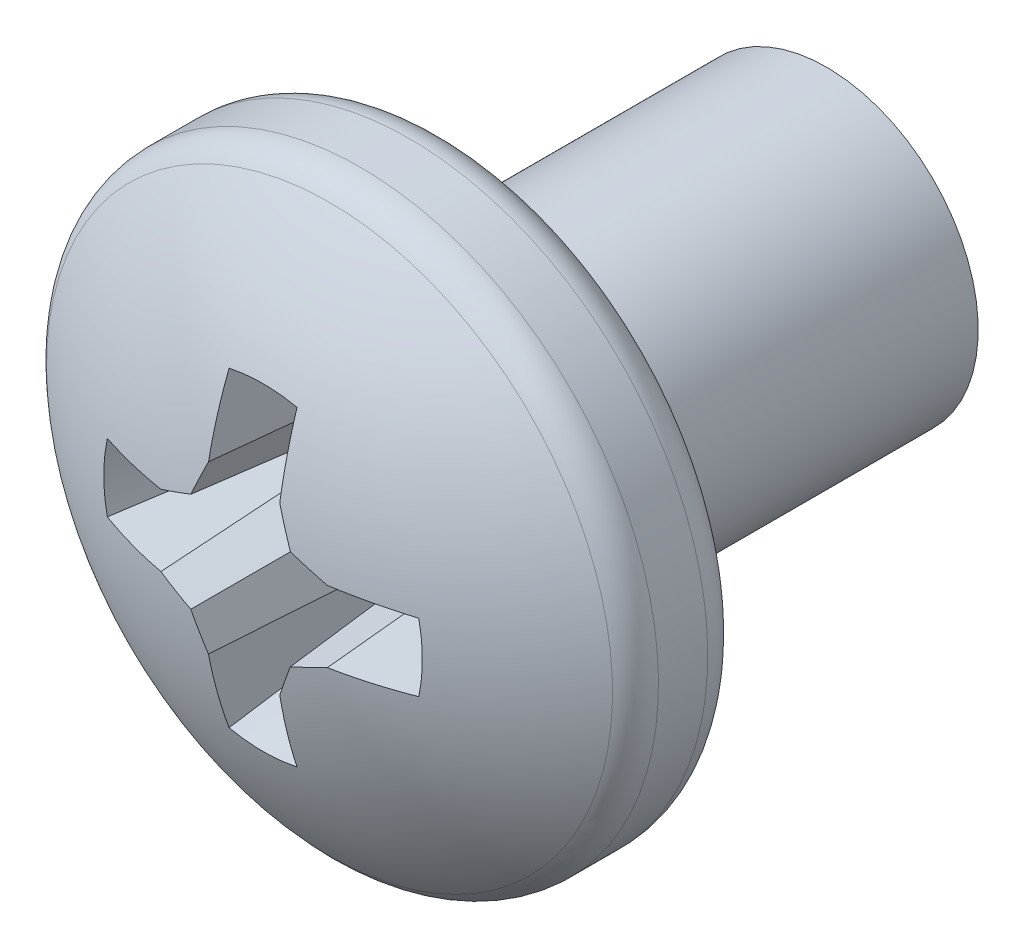
ISO-10303-21;
HEADER;
FILE_DESCRIPTION(('STEP AP214'),'2;1');
FILE_NAME('part.step','',(''),(''),'','','');
FILE_SCHEMA(('AUTOMOTIVE_DESIGN { 1 0 10303 214 1 1 1 1 }'));
ENDSEC;
DATA;
#1=APPLICATION_CONTEXT('core data for automotive mechanical design processes');
#2=APPLICATION_PROTOCOL_DEFINITION('international standard','automotive_design',2000,#1);
#3=PRODUCT_CONTEXT('',#1,'mechanical');
#4=PRODUCT('Part','Part','',(#3));
#5=PRODUCT_RELATED_PRODUCT_CATEGORY('part','',(#4));
#6=PRODUCT_DEFINITION_FORMATION('','',#4);
#7=PRODUCT_DEFINITION_CONTEXT('part definition',#1,'design');
#8=PRODUCT_DEFINITION('design','',#6,#7);
#9=PRODUCT_DEFINITION_SHAPE('','',#8);
#10=(LENGTH_UNIT() NAMED_UNIT(*) SI_UNIT(.MILLI.,.METRE.));
#11=(NAMED_UNIT(*) PLANE_ANGLE_UNIT() SI_UNIT($,.RADIAN.));
#12=(NAMED_UNIT(*) SI_UNIT($,.STERADIAN.) SOLID_ANGLE_UNIT());
#13=UNCERTAINTY_MEASURE_WITH_UNIT(LENGTH_MEASURE(1.E-05),#10,'distance_accuracy_value','');
#14=(GEOMETRIC_REPRESENTATION_CONTEXT(3) GLOBAL_UNCERTAINTY_ASSIGNED_CONTEXT((#13)) GLOBAL_UNIT_ASSIGNED_CONTEXT((#10,
#11,#12)) REPRESENTATION_CONTEXT('',''));
#15=CARTESIAN_POINT('',(0.,0.,0.));
#16=DIRECTION('',(0.,0.,1.));
#17=DIRECTION('',(1.,0.,0.));
#18=AXIS2_PLACEMENT_3D('',#15,#16,#17);
#19=CARTESIAN_POINT('',(0.,0.,7.9375));
#20=DIRECTION('',(0.,0.,-1.));
#21=DIRECTION('',(-1.,0.,0.));
#22=AXIS2_PLACEMENT_3D('',#19,#20,#21);
#23=PLANE('',#22);
#24=CARTESIAN_POINT('',(0.,0.,7.9375));
#25=DIRECTION('',(0.,0.,-1.));
#26=DIRECTION('',(-1.,0.,0.));
#27=AXIS2_PLACEMENT_3D('',#24,#25,#26);
#28=CIRCLE('',#27,3.175);
#29=CARTESIAN_POINT('',(-3.175,0.,7.9375));
#30=VERTEX_POINT('',#29);
#31=EDGE_CURVE('E11',#30,#30,#28,.T.);
#32=ORIENTED_EDGE('',*,*,#31,.F.);
#33=EDGE_LOOP('',(#32));
#34=FACE_BOUND('',#33,.T.);
#35=CARTESIAN_POINT('',(0.,0.,7.93749999999999));
#36=DIRECTION('',(0.,0.,1.));
#37=DIRECTION('',(0.,-1.,0.));
#38=AXIS2_PLACEMENT_3D('',#35,#36,#37);
#39=CIRCLE('',#38,5.4483);
#40=CARTESIAN_POINT('',(0.,-5.4483,7.93749999999999));
#41=VERTEX_POINT('',#40);
#42=EDGE_CURVE('E664',#41,#41,#39,.T.);
#43=ORIENTED_EDGE('',*,*,#42,.F.);
#44=EDGE_LOOP('',(#43));
#45=FACE_BOUND('',#44,.T.);
#46=ADVANCED_FACE('F35',(#34,#45),#23,.T.);
#47=CARTESIAN_POINT('',(0.,0.,8.73759999999999));
#48=DIRECTION('',(0.,0.,1.));
#49=DIRECTION('',(0.,-1.,0.));
#50=AXIS2_PLACEMENT_3D('',#47,#48,#49);
#51=TOROIDAL_SURFACE('',#50,5.4483,0.800099999999999);
#52=ORIENTED_EDGE('',*,*,#42,.T.);
#53=EDGE_LOOP('',(#52));
#54=FACE_BOUND('',#53,.T.);
#55=CARTESIAN_POINT('',(0.,0.,8.73759999999999));
#56=DIRECTION('',(0.,0.,1.));
#57=DIRECTION('',(0.,-1.,0.));
#58=AXIS2_PLACEMENT_3D('',#55,#56,#57);
#59=CIRCLE('',#58,6.24839999999999);
#60=CARTESIAN_POINT('',(0.,-6.2484,8.73759999999998));
#61=VERTEX_POINT('',#60);
#62=EDGE_CURVE('E667',#61,#61,#59,.T.);
#63=ORIENTED_EDGE('',*,*,#62,.F.);
#64=EDGE_LOOP('',(#63));
#65=FACE_BOUND('',#64,.T.);
#66=ADVANCED_FACE('F221',(#54,#65),#51,.T.);
#67=CARTESIAN_POINT('',(0.,0.,0.));
#68=DIRECTION('',(0.,0.,-1.));
#69=DIRECTION('',(-1.,0.,0.));
#70=AXIS2_PLACEMENT_3D('',#67,#68,#69);
#71=CYLINDRICAL_SURFACE('',#70,6.24839999999999);
#72=ORIENTED_EDGE('',*,*,#62,.T.);
#73=EDGE_LOOP('',(#72));
#74=FACE_BOUND('',#73,.T.);
#75=CARTESIAN_POINT('',(0.,0.,9.76982109068952));
#76=DIRECTION('',(0.,0.,1.));
#77=DIRECTION('',(0.,-1.,0.));
#78=AXIS2_PLACEMENT_3D('',#75,#76,#77);
#79=CIRCLE('',#78,6.2484);
#80=CARTESIAN_POINT('',(0.,-6.2484,9.76982109068951));
#81=VERTEX_POINT('',#80);
#82=EDGE_CURVE('E671',#81,#81,#79,.T.);
#83=ORIENTED_EDGE('',*,*,#82,.F.);
#84=EDGE_LOOP('',(#83));
#85=FACE_BOUND('',#84,.T.);
#86=ADVANCED_FACE('F227',(#74,#85),#71,.T.);
#87=CARTESIAN_POINT('',(0.,0.,2.48778485714284));
#88=DIRECTION('',(0.,0.,1.));
#89=DIRECTION('',(0.,1.,0.));
#90=AXIS2_PLACEMENT_3D('',#87,#88,#89);
#91=SPHERICAL_SURFACE('',#90,9.89471514285716);
#92=CARTESIAN_POINT('',(0.,0.,11.8027597430115));
#93=DIRECTION('',(0.,0.,-1.));
#94=DIRECTION('',(-1.,0.,0.));
#95=AXIS2_PLACEMENT_3D('',#92,#93,#94);
#96=CIRCLE('',#95,3.33715906632012);
#97=CARTESIAN_POINT('',(3.26047732574647,-0.711279299723926,11.8027597430115));
#98=VERTEX_POINT('',#97);
#99=CARTESIAN_POINT('',(3.26047732574647,0.711279299723897,11.8027597430115));
#100=VERTEX_POINT('',#99);
#101=EDGE_CURVE('E374',#98,#100,#96,.F.);
#102=ORIENTED_EDGE('',*,*,#101,.F.);
#103=CARTESIAN_POINT('',(0.,0.102887872647611,2.4967863796138));
#104=DIRECTION('',(0.,0.996194698091745,0.0871557427476594));
#105=DIRECTION('',(0.,-0.0871557427476594,0.996194698091745));
#106=AXIS2_PLACEMENT_3D('',#103,#104,#105);
#107=CIRCLE('',#106,9.89417610600004);
#108=CARTESIAN_POINT('',(1.74305929475043,-0.7459592414911,12.1991532912671));
#109=VERTEX_POINT('',#108);
#110=EDGE_CURVE('E44',#109,#98,#107,.T.);
#111=ORIENTED_EDGE('',*,*,#110,.F.);
#112=CARTESIAN_POINT('',(0.192387852615012,-0.464465363019021,2.44380135882443));
#113=DIRECTION('',(-0.381227206369642,0.920363891963229,0.0871557427476598));
#114=DIRECTION('',(-0.923879532511292,-0.382683432365078,0.));
#115=AXIS2_PLACEMENT_3D('',#112,#113,#114);
#116=CIRCLE('',#115,9.88183748352928);
#117=CARTESIAN_POINT('',(1.04287867560571,-1.04287867560572,12.271965757669));
#118=VERTEX_POINT('',#117);
#119=EDGE_CURVE('E392',#118,#109,#116,.T.);
#120=ORIENTED_EDGE('',*,*,#119,.F.);
#121=CARTESIAN_POINT('',(0.464465363019016,-0.192387852615024,2.44380135882443));
#122=DIRECTION('',(-0.920363891963226,0.38122720636965,0.0871557427476598));
#123=DIRECTION('',(-0.382683432365087,-0.923879532511288,0.));
#124=AXIS2_PLACEMENT_3D('',#121,#122,#123);
#125=CIRCLE('',#124,9.88183748352928);
#126=CARTESIAN_POINT('',(0.745959241491083,-1.74305929475044,12.1991532912671));
#127=VERTEX_POINT('',#126);
#128=EDGE_CURVE('E396',#127,#118,#125,.T.);
#129=ORIENTED_EDGE('',*,*,#128,.F.);
#130=CARTESIAN_POINT('',(-0.102887872647616,0.,2.4967863796138));
#131=DIRECTION('',(-0.996194698091745,0.,0.0871557427476594));
#132=DIRECTION('',(0.0871557427476594,0.,0.996194698091745));
#133=AXIS2_PLACEMENT_3D('',#130,#131,#132);
#134=CIRCLE('',#133,9.89417610600004);
#135=CARTESIAN_POINT('',(0.711279299723898,-3.2604773257465,11.8027597430115));
#136=VERTEX_POINT('',#135);
#137=EDGE_CURVE('E353',#136,#127,#134,.T.);
#138=ORIENTED_EDGE('',*,*,#137,.F.);
#139=CARTESIAN_POINT('',(0.,0.,11.8027597430115));
#140=DIRECTION('',(0.,0.,-1.));
#141=DIRECTION('',(0.,1.,0.));
#142=AXIS2_PLACEMENT_3D('',#139,#140,#141);
#143=CIRCLE('',#142,3.33715906632012);
#144=CARTESIAN_POINT('',(-0.711279299723924,-3.2604773257465,11.8027597430115));
#145=VERTEX_POINT('',#144);
#146=EDGE_CURVE('E401',#145,#136,#143,.F.);
#147=ORIENTED_EDGE('',*,*,#146,.F.);
#148=CARTESIAN_POINT('',(0.102887872647614,0.,2.4967863796138));
#149=DIRECTION('',(0.996194698091746,0.,0.0871557427476584));
#150=DIRECTION('',(0.0871557427476584,0.,-0.996194698091746));
#151=AXIS2_PLACEMENT_3D('',#148,#149,#150);
#152=CIRCLE('',#151,9.89417610600004);
#153=CARTESIAN_POINT('',(-0.745959241491093,-1.74305929475044,12.1991532912671));
#154=VERTEX_POINT('',#153);
#155=EDGE_CURVE('E333',#154,#145,#152,.T.);
#156=ORIENTED_EDGE('',*,*,#155,.F.);
#157=CARTESIAN_POINT('',(-0.464465363019017,-0.192387852615018,2.44380135882443));
#158=DIRECTION('',(0.920363891963231,0.381227206369638,0.0871557427476592));
#159=DIRECTION('',(-0.382683432365075,0.923879532511293,0.));
#160=AXIS2_PLACEMENT_3D('',#157,#158,#159);
#161=CIRCLE('',#160,9.88183748352928);
#162=CARTESIAN_POINT('',(-1.04287867560571,-1.04287867560572,12.271965757669));
#163=VERTEX_POINT('',#162);
#164=EDGE_CURVE('E417',#163,#154,#161,.T.);
#165=ORIENTED_EDGE('',*,*,#164,.F.);
#166=CARTESIAN_POINT('',(-0.192387852615018,-0.46446536301902,2.44380135882443));
#167=DIRECTION('',(0.381227206369654,0.920363891963224,0.0871557427476603));
#168=DIRECTION('',(-0.923879532511287,0.38268343236509,0.));
#169=AXIS2_PLACEMENT_3D('',#166,#167,#168);
#170=CIRCLE('',#169,9.88183748352928);
#171=CARTESIAN_POINT('',(-1.74305929475043,-0.74595924149109,12.1991532912671));
#172=VERTEX_POINT('',#171);
#173=EDGE_CURVE('E418',#172,#163,#170,.T.);
#174=ORIENTED_EDGE('',*,*,#173,.F.);
#175=CARTESIAN_POINT('',(0.,0.102887872647613,2.4967863796138));
#176=DIRECTION('',(0.,0.996194698091745,0.0871557427476605));
#177=DIRECTION('',(0.,-0.0871557427476605,0.996194698091745));
#178=AXIS2_PLACEMENT_3D('',#175,#176,#177);
#179=CIRCLE('',#178,9.89417610600004);
#180=CARTESIAN_POINT('',(-3.26047732574649,-0.711279299723899,11.8027597430115));
#181=VERTEX_POINT('',#180);
#182=EDGE_CURVE('E311',#181,#172,#179,.T.);
#183=ORIENTED_EDGE('',*,*,#182,.F.);
#184=CARTESIAN_POINT('',(0.,0.,11.8027597430115));
#185=DIRECTION('',(0.,0.,-1.));
#186=DIRECTION('',(-1.,0.,0.));
#187=AXIS2_PLACEMENT_3D('',#184,#185,#186);
#188=CIRCLE('',#187,3.33715906632012);
#189=CARTESIAN_POINT('',(-3.26047732574648,0.711279299723923,11.8027597430115));
#190=VERTEX_POINT('',#189);
#191=EDGE_CURVE('E188',#190,#181,#188,.F.);
#192=ORIENTED_EDGE('',*,*,#191,.F.);
#193=CARTESIAN_POINT('',(0.,-0.102887872647617,2.4967863796138));
#194=DIRECTION('',(0.,-0.996194698091746,0.0871557427476573));
#195=DIRECTION('',(0.,-0.0871557427476573,-0.996194698091746));
#196=AXIS2_PLACEMENT_3D('',#193,#194,#195);
#197=CIRCLE('',#196,9.89417610600004);
#198=CARTESIAN_POINT('',(-1.74305929475043,0.745959241491086,12.1991532912671));
#199=VERTEX_POINT('',#198);
#200=EDGE_CURVE('E184',#199,#190,#197,.T.);
#201=ORIENTED_EDGE('',*,*,#200,.F.);
#202=CARTESIAN_POINT('',(-0.192387852615011,0.464465363019016,2.44380135882443));
#203=DIRECTION('',(0.381227206369635,-0.920363891963232,0.0871557427476578));
#204=DIRECTION('',(0.923879532511294,0.382683432365071,0.));
#205=AXIS2_PLACEMENT_3D('',#202,#203,#204);
#206=CIRCLE('',#205,9.88183748352928);
#207=CARTESIAN_POINT('',(-1.04287867560571,1.0428786756057,12.271965757669));
#208=VERTEX_POINT('',#207);
#209=EDGE_CURVE('E183',#208,#199,#206,.T.);
#210=ORIENTED_EDGE('',*,*,#209,.F.);
#211=CARTESIAN_POINT('',(-0.464465363019017,0.192387852615015,2.44380135882443));
#212=DIRECTION('',(0.920363891963223,-0.381227206369657,0.0871557427476589));
#213=DIRECTION('',(0.382683432365093,0.923879532511285,0.));
#214=AXIS2_PLACEMENT_3D('',#211,#212,#213);
#215=CIRCLE('',#214,9.88183748352928);
#216=CARTESIAN_POINT('',(-0.745959241491071,1.74305929475042,12.1991532912671));
#217=VERTEX_POINT('',#216);
#218=EDGE_CURVE('E156',#217,#208,#215,.T.);
#219=ORIENTED_EDGE('',*,*,#218,.F.);
#220=CARTESIAN_POINT('',(0.102887872647616,0.,2.4967863796138));
#221=DIRECTION('',(0.996194698091745,0.,0.0871557427476594));
#222=DIRECTION('',(0.0871557427476594,0.,-0.996194698091745));
#223=AXIS2_PLACEMENT_3D('',#220,#221,#222);
#224=CIRCLE('',#223,9.89417610600004);
#225=CARTESIAN_POINT('',(-0.711279299723875,3.26047732574647,11.8027597430115));
#226=VERTEX_POINT('',#225);
#227=EDGE_CURVE('E162',#226,#217,#224,.T.);
#228=ORIENTED_EDGE('',*,*,#227,.F.);
#229=CARTESIAN_POINT('',(0.,0.,11.8027597430115));
#230=DIRECTION('',(0.,0.,-1.));
#231=DIRECTION('',(-1.,0.,0.));
#232=AXIS2_PLACEMENT_3D('',#229,#230,#231);
#233=CIRCLE('',#232,3.33715906632012);
#234=CARTESIAN_POINT('',(0.711279299723901,3.26047732574647,11.8027597430115));
#235=VERTEX_POINT('',#234);
#236=EDGE_CURVE('E171',#235,#226,#233,.F.);
#237=ORIENTED_EDGE('',*,*,#236,.F.);
#238=CARTESIAN_POINT('',(-0.102887872647614,0.,2.4967863796138));
#239=DIRECTION('',(-0.996194698091746,0.,0.0871557427476584));
#240=DIRECTION('',(0.0871557427476584,0.,0.996194698091746));
#241=AXIS2_PLACEMENT_3D('',#238,#239,#240);
#242=CIRCLE('',#241,9.89417610600004);
#243=CARTESIAN_POINT('',(0.745959241491081,1.74305929475042,12.1991532912671));
#244=VERTEX_POINT('',#243);
#245=EDGE_CURVE('E52',#244,#235,#242,.T.);
#246=ORIENTED_EDGE('',*,*,#245,.F.);
#247=CARTESIAN_POINT('',(0.464465363019019,0.192387852615009,2.44380135882443));
#248=DIRECTION('',(-0.920363891963228,-0.381227206369645,0.0871557427476584));
#249=DIRECTION('',(0.382683432365081,-0.92387953251129,0.));
#250=AXIS2_PLACEMENT_3D('',#247,#248,#249);
#251=CIRCLE('',#250,9.88183748352928);
#252=CARTESIAN_POINT('',(1.04287867560571,1.0428786756057,12.271965757669));
#253=VERTEX_POINT('',#252);
#254=EDGE_CURVE('E685',#253,#244,#251,.T.);
#255=ORIENTED_EDGE('',*,*,#254,.F.);
#256=CARTESIAN_POINT('',(0.192387852615018,0.464465363019015,2.44380135882443));
#257=DIRECTION('',(-0.381227206369647,-0.920363891963227,0.0871557427476584));
#258=DIRECTION('',(0.923879532511289,-0.382683432365084,0.));
#259=AXIS2_PLACEMENT_3D('',#256,#257,#258);
#260=CIRCLE('',#259,9.88183748352928);
#261=CARTESIAN_POINT('',(1.74305929475043,0.745959241491076,12.1991532912671));
#262=VERTEX_POINT('',#261);
#263=EDGE_CURVE('E382',#262,#253,#260,.T.);
#264=ORIENTED_EDGE('',*,*,#263,.F.);
#265=CARTESIAN_POINT('',(0.,-0.102887872647619,2.4967863796138));
#266=DIRECTION('',(0.,-0.996194698091746,0.0871557427476584));
#267=DIRECTION('',(0.,-0.0871557427476584,-0.996194698091746));
#268=AXIS2_PLACEMENT_3D('',#265,#266,#267);
#269=CIRCLE('',#268,9.89417610600004);
#270=EDGE_CURVE('E385',#100,#262,#269,.T.);
#271=ORIENTED_EDGE('',*,*,#270,.F.);
#272=EDGE_LOOP('',(#102,#111,#120,#129,#138,#147,#156,#165,#174,#183,#192,#201,#210,#219,#228,
#237,#246,#255,#264,#271));
#273=FACE_BOUND('',#272,.T.);
#274=CARTESIAN_POINT('',(0.,0.,10.4104592154415));
#275=DIRECTION('',(0.,0.,1.));
#276=DIRECTION('',(0.,-1.,0.));
#277=AXIS2_PLACEMENT_3D('',#274,#275,#276);
#278=CIRCLE('',#277,5.92761493103627);
#279=CARTESIAN_POINT('',(0.,-5.92761493103627,10.4104592154415));
#280=VERTEX_POINT('',#279);
#281=EDGE_CURVE('E386',#280,#280,#278,.T.);
#282=ORIENTED_EDGE('',*,*,#281,.T.);
#283=EDGE_LOOP('',(#282));
#284=FACE_BOUND('',#283,.T.);
#285=ADVANCED_FACE('F180',(#273,#284),#91,.T.);
#286=CARTESIAN_POINT('',(0.,0.,9.76982109068952));
#287=DIRECTION('',(0.,0.,1.));
#288=DIRECTION('',(0.,-1.,0.));
#289=AXIS2_PLACEMENT_3D('',#286,#287,#288);
#290=TOROIDAL_SURFACE('',#289,5.4483,0.800100000000001);
#291=ORIENTED_EDGE('',*,*,#82,.T.);
#292=EDGE_LOOP('',(#291));
#293=FACE_BOUND('',#292,.T.);
#294=ORIENTED_EDGE('',*,*,#281,.F.);
#295=EDGE_LOOP('',(#294));
#296=FACE_BOUND('',#295,.T.);
#297=ADVANCED_FACE('F525',(#293,#296),#290,.T.);
#298=CARTESIAN_POINT('',(0.,0.,12.3825));
#299=DIRECTION('',(0.,0.,1.));
#300=DIRECTION('',(1.,0.,0.));
#301=AXIS2_PLACEMENT_3D('',#298,#299,#300);
#302=CONICAL_SURFACE('',#301,3.4925,0.26179938779915);
#303=ORIENTED_EDGE('',*,*,#236,.T.);
#304=CARTESIAN_POINT('',(-0.711279299723875,3.26047732574648,11.8027597430115));
#305=CARTESIAN_POINT('',(-0.673957585120178,3.15162235017542,11.3761705930625));
#306=CARTESIAN_POINT('',(-0.63663737190976,3.04269951536287,10.9495986041172));
#307=CARTESIAN_POINT('',(-0.562001655695431,2.82464263025924,10.0965084641334));
#308=CARTESIAN_POINT('',(-0.524686152688909,2.71550858008584,9.66999031306498));
#309=CARTESIAN_POINT('',(-0.450061508306111,2.49695360394821,8.81702672469462));
#310=CARTESIAN_POINT('',(-0.412752366932298,2.38753267787317,8.39058128742082));
#311=CARTESIAN_POINT('',(-0.338144214529254,2.1682362066271,7.53780620324162));
#312=CARTESIAN_POINT('',(-0.30084520350586,2.0583606611947,7.11147655640294));
#313=CARTESIAN_POINT('',(-0.263553156261428,1.94817397620701,6.68522650592204));
#314=B_SPLINE_CURVE_WITH_KNOTS('',3,(#304,#305,#306,#307,#308,#309,#310,#311,#312,#313),
.UNSPECIFIED.,.F.,.F.,(4,2,2,2,4),(0.,1.32551334504877,2.65102595177396,3.97653907060171,
5.30205295162484),.UNSPECIFIED.);
#315=CARTESIAN_POINT('',(-0.431445957033155,2.44230513669558,8.60425));
#316=VERTEX_POINT('',#315);
#317=EDGE_CURVE('E168',#316,#226,#314,.F.);
#318=ORIENTED_EDGE('',*,*,#317,.F.);
#319=CARTESIAN_POINT('',(0.,0.,8.60425));
#320=DIRECTION('',(0.,0.,1.));
#321=DIRECTION('',(1.,0.,0.));
#322=AXIS2_PLACEMENT_3D('',#319,#320,#321);
#323=CIRCLE('',#322,2.48012096369711);
#324=CARTESIAN_POINT('',(0.431445957033177,2.44230513669558,8.60425));
#325=VERTEX_POINT('',#324);
#326=EDGE_CURVE('E422',#325,#316,#323,.T.);
#327=ORIENTED_EDGE('',*,*,#326,.F.);
#328=CARTESIAN_POINT('',(1.07866028506743,4.32999471145697,16.001943620528));
#329=CARTESIAN_POINT('',(1.02471521730433,4.17316329067105,15.3853486745198));
#330=CARTESIAN_POINT('',(0.970771457228881,4.01627260548618,14.7687686754498));
#331=CARTESIAN_POINT('',(0.862888250209881,3.70229679892619,13.535657976633));
#332=CARTESIAN_POINT('',(0.808948803265258,3.54521167759956,12.919127276874));
#333=CARTESIAN_POINT('',(0.701075883084547,3.23077098327433,11.6861341571568));
#334=CARTESIAN_POINT('',(0.647142409849598,3.07341541022422,11.0696717372118));
#335=CARTESIAN_POINT('',(0.539285567895031,2.75824845591055,9.83686239246042));
#336=CARTESIAN_POINT('',(0.485362199178048,2.6004370745283,9.22051546768422));
#337=CARTESIAN_POINT('',(0.431445957033177,2.44230513669558,8.60425));
#338=B_SPLINE_CURVE_WITH_KNOTS('',3,(#328,#329,#330,#331,#332,#333,#334,#335,#336,#337),
.UNSPECIFIED.,.F.,.F.,(4,2,2,2,4),(0.,1.915531119211,3.83106176073978,5.74659276712294,
7.6621242723694),.UNSPECIFIED.);
#339=EDGE_CURVE('E668',#325,#235,#338,.F.);
#340=ORIENTED_EDGE('',*,*,#339,.T.);
#341=EDGE_LOOP('',(#303,#318,#327,#340));
#342=FACE_BOUND('',#341,.T.);
#343=ADVANCED_FACE('F249',(#342),#302,.F.);
#344=CARTESIAN_POINT('',(0.762,0.,12.3825));
#345=DIRECTION('',(-0.996194698091746,0.,0.0871557427476584));
#346=DIRECTION('',(0.0871557427476584,0.,0.996194698091746));
#347=AXIS2_PLACEMENT_3D('',#344,#345,#346);
#348=PLANE('',#347);
#349=ORIENTED_EDGE('',*,*,#245,.T.);
#350=ORIENTED_EDGE('',*,*,#339,.F.);
#351=DIRECTION('',(0.,-1.,0.));
#352=VECTOR('',#351,1.);
#353=CARTESIAN_POINT('',(0.431445957033177,0.,8.60425));
#354=LINE('',#353,#352);
#355=CARTESIAN_POINT('',(0.431445957033177,1.68049871276655,8.60425));
#356=VERTEX_POINT('',#355);
#357=EDGE_CURVE('E424',#356,#325,#354,.F.);
#358=ORIENTED_EDGE('',*,*,#357,.F.);
#359=DIRECTION('',(0.0871426484044397,0.0173337504938598,0.996045029063886));
#360=VECTOR('',#359,1.);
#361=CARTESIAN_POINT('',(0.759362273790039,1.74572532363508,12.3523506514598));
#362=LINE('',#361,#360);
#363=EDGE_CURVE('E682',#356,#244,#362,.T.);
#364=ORIENTED_EDGE('',*,*,#363,.T.);
#365=EDGE_LOOP('',(#349,#350,#358,#364));
#366=FACE_BOUND('',#365,.T.);
#367=ADVANCED_FACE('F512',(#366),#348,.T.);
#368=CARTESIAN_POINT('',(1.26780029195557,0.525140075308554,12.3825));
#369=DIRECTION('',(-0.920363891963228,-0.381227206369645,0.0871557427476584));
#370=DIRECTION('',(0.382683432365081,-0.92387953251129,0.));
#371=AXIS2_PLACEMENT_3D('',#368,#369,#370);
#372=PLANE('',#371);
#373=ORIENTED_EDGE('',*,*,#254,.T.);
#374=ORIENTED_EDGE('',*,*,#363,.F.);
#375=DIRECTION('',(0.382683432365081,-0.92387953251129,0.));
#376=VECTOR('',#375,1.);
#377=CARTESIAN_POINT('',(0.962408177269667,0.398642519563855,8.60425));
#378=LINE('',#377,#376);
#379=CARTESIAN_POINT('',(0.797285039127732,0.79728503912773,8.60425));
#380=VERTEX_POINT('',#379);
#381=EDGE_CURVE('E701',#380,#356,#378,.F.);
#382=ORIENTED_EDGE('',*,*,#381,.F.);
#383=DIRECTION('',(0.0666626913468326,0.0666626913468325,0.995546167269401));
#384=VECTOR('',#383,1.);
#385=CARTESIAN_POINT('',(1.04891311395742,1.04891311395742,12.3620845610251));
#386=LINE('',#385,#384);
#387=EDGE_CURVE('E679',#380,#253,#386,.T.);
#388=ORIENTED_EDGE('',*,*,#387,.T.);
#389=EDGE_LOOP('',(#373,#374,#382,#388));
#390=FACE_BOUND('',#389,.T.);
#391=ADVANCED_FACE('F340',(#390),#372,.T.);
#392=CARTESIAN_POINT('',(0.525140075308557,1.26780029195557,12.3825));
#393=DIRECTION('',(-0.381227206369647,-0.920363891963227,0.0871557427476584));
#394=DIRECTION('',(0.923879532511289,-0.382683432365084,0.));
#395=AXIS2_PLACEMENT_3D('',#392,#393,#394);
#396=PLANE('',#395);
#397=ORIENTED_EDGE('',*,*,#263,.T.);
#398=ORIENTED_EDGE('',*,*,#387,.F.);
#399=DIRECTION('',(0.923879532511289,-0.382683432365084,0.));
#400=VECTOR('',#399,1.);
#401=CARTESIAN_POINT('',(0.398642519563858,0.962408177269666,8.60425));
#402=LINE('',#401,#400);
#403=CARTESIAN_POINT('',(1.68049871276655,0.431445957033172,8.60425));
#404=VERTEX_POINT('',#403);
#405=EDGE_CURVE('E379',#404,#380,#402,.F.);
#406=ORIENTED_EDGE('',*,*,#405,.F.);
#407=DIRECTION('',(0.01733375049386,0.0871426484044397,0.996045029063886));
#408=VECTOR('',#407,1.);
#409=CARTESIAN_POINT('',(1.74664712250287,0.763996469641892,12.4053197524278));
#410=LINE('',#409,#408);
#411=EDGE_CURVE('E676',#404,#262,#410,.T.);
#412=ORIENTED_EDGE('',*,*,#411,.T.);
#413=EDGE_LOOP('',(#397,#398,#406,#412));
#414=FACE_BOUND('',#413,.T.);
#415=ADVANCED_FACE('F498',(#414),#396,.T.);
#416=CARTESIAN_POINT('',(0.,0.761999999999995,12.3825));
#417=DIRECTION('',(0.,-0.996194698091746,0.0871557427476584));
#418=DIRECTION('',(0.,-0.0871557427476584,-0.996194698091746));
#419=AXIS2_PLACEMENT_3D('',#416,#417,#418);
#420=PLANE('',#419);
#421=ORIENTED_EDGE('',*,*,#270,.T.);
#422=ORIENTED_EDGE('',*,*,#411,.F.);
#423=DIRECTION('',(1.,0.,0.));
#424=VECTOR('',#423,1.);
#425=CARTESIAN_POINT('',(0.,0.431445957033172,8.60425));
#426=LINE('',#425,#424);
#427=CARTESIAN_POINT('',(2.44230513669558,0.431445957033172,8.60425));
#428=VERTEX_POINT('',#427);
#429=EDGE_CURVE('E377',#428,#404,#426,.F.);
#430=ORIENTED_EDGE('',*,*,#429,.F.);
#431=CARTESIAN_POINT('',(3.26047732574648,0.711279299723897,11.8027597430115));
#432=CARTESIAN_POINT('',(3.15162235017542,0.673957585120199,11.3761705930625));
#433=CARTESIAN_POINT('',(3.04269951536287,0.63663737190978,10.9495986041172));
#434=CARTESIAN_POINT('',(2.82464263025923,0.56200165569545,10.0965084641334));
#435=CARTESIAN_POINT('',(2.71550858008584,0.524686152688928,9.66999031306498));
#436=CARTESIAN_POINT('',(2.49695360394821,0.450061508306128,8.81702672469462));
#437=CARTESIAN_POINT('',(2.38753267787317,0.412752366932315,8.39058128742082));
#438=CARTESIAN_POINT('',(2.1682362066271,0.338144214529269,7.53780620324162));
#439=CARTESIAN_POINT('',(2.0583606611947,0.300845203505874,7.11147655640294));
#440=CARTESIAN_POINT('',(1.94817397620701,0.263553156261442,6.68522650592204));
#441=B_SPLINE_CURVE_WITH_KNOTS('',3,(#431,#432,#433,#434,#435,#436,#437,#438,#439,#440),
.UNSPECIFIED.,.F.,.F.,(4,2,2,2,4),(0.,1.32551334504877,2.65102595177396,3.97653907060171,
5.30205295162484),.UNSPECIFIED.);
#442=EDGE_CURVE('E254',#428,#100,#441,.F.);
#443=ORIENTED_EDGE('',*,*,#442,.T.);
#444=EDGE_LOOP('',(#421,#422,#430,#443));
#445=FACE_BOUND('',#444,.T.);
#446=ADVANCED_FACE('F247',(#445),#420,.T.);
#447=CARTESIAN_POINT('',(0.,0.,12.3825));
#448=DIRECTION('',(0.,0.,1.));
#449=DIRECTION('',(1.,0.,0.));
#450=AXIS2_PLACEMENT_3D('',#447,#448,#449);
#451=CONICAL_SURFACE('',#450,3.4925,0.26179938779915);
#452=ORIENTED_EDGE('',*,*,#101,.T.);
#453=ORIENTED_EDGE('',*,*,#442,.F.);
#454=CARTESIAN_POINT('',(0.,0.,8.60425));
#455=DIRECTION('',(0.,0.,1.));
#456=DIRECTION('',(1.,0.,0.));
#457=AXIS2_PLACEMENT_3D('',#454,#455,#456);
#458=CIRCLE('',#457,2.48012096369711);
#459=CARTESIAN_POINT('',(2.44230513669557,-0.431445957033195,8.60425));
#460=VERTEX_POINT('',#459);
#461=EDGE_CURVE('E271',#460,#428,#458,.T.);
#462=ORIENTED_EDGE('',*,*,#461,.F.);
#463=CARTESIAN_POINT('',(4.32999471145696,-1.07866028506746,16.001943620528));
#464=CARTESIAN_POINT('',(4.17316329067105,-1.02471521730436,15.3853486745198));
#465=CARTESIAN_POINT('',(4.01627260548617,-0.970771457228911,14.7687686754498));
#466=CARTESIAN_POINT('',(3.70229679892618,-0.862888250209909,13.535657976633));
#467=CARTESIAN_POINT('',(3.54521167759956,-0.808948803265285,12.919127276874));
#468=CARTESIAN_POINT('',(3.23077098327433,-0.701075883084571,11.6861341571568));
#469=CARTESIAN_POINT('',(3.07341541022422,-0.647142409849621,11.0696717372118));
#470=CARTESIAN_POINT('',(2.75824845591055,-0.539285567895051,9.83686239246042));
#471=CARTESIAN_POINT('',(2.6004370745283,-0.485362199178067,9.22051546768422));
#472=CARTESIAN_POINT('',(2.44230513669557,-0.431445957033194,8.60425));
#473=B_SPLINE_CURVE_WITH_KNOTS('',3,(#463,#464,#465,#466,#467,#468,#469,#470,#471,#472),
.UNSPECIFIED.,.F.,.F.,(4,2,2,2,4),(0.,1.915531119211,3.83106176073979,5.74659276712294,
7.66212427236941),.UNSPECIFIED.);
#474=EDGE_CURVE('E262',#460,#98,#473,.F.);
#475=ORIENTED_EDGE('',*,*,#474,.T.);
#476=EDGE_LOOP('',(#452,#453,#462,#475));
#477=FACE_BOUND('',#476,.T.);
#478=ADVANCED_FACE('F242',(#477),#451,.F.);
#479=CARTESIAN_POINT('',(0.,0.,8.60425));
#480=DIRECTION('',(0.,0.,1.));
#481=DIRECTION('',(1.,0.,0.));
#482=AXIS2_PLACEMENT_3D('',#479,#480,#481);
#483=PLANE('',#482);
#484=DIRECTION('',(-1.,0.,0.));
#485=VECTOR('',#484,1.);
#486=CARTESIAN_POINT('',(0.,-0.431445957033186,8.60425));
#487=LINE('',#486,#485);
#488=CARTESIAN_POINT('',(1.68049871276656,-0.431445957033192,8.60425));
#489=VERTEX_POINT('',#488);
#490=EDGE_CURVE('E273',#489,#460,#487,.F.);
#491=ORIENTED_EDGE('',*,*,#490,.T.);
#492=ORIENTED_EDGE('',*,*,#461,.T.);
#493=ORIENTED_EDGE('',*,*,#429,.T.);
#494=ORIENTED_EDGE('',*,*,#405,.T.);
#495=ORIENTED_EDGE('',*,*,#381,.T.);
#496=ORIENTED_EDGE('',*,*,#357,.T.);
#497=ORIENTED_EDGE('',*,*,#326,.T.);
#498=DIRECTION('',(0.,1.,0.));
#499=VECTOR('',#498,1.);
#500=CARTESIAN_POINT('',(-0.431445957033181,0.,8.60425));
#501=LINE('',#500,#499);
#502=CARTESIAN_POINT('',(-0.431445957033163,1.68049871276655,8.60425));
#503=VERTEX_POINT('',#502);
#504=EDGE_CURVE('E436',#316,#503,#501,.F.);
#505=ORIENTED_EDGE('',*,*,#504,.T.);
#506=DIRECTION('',(0.382683432365093,0.923879532511285,0.));
#507=VECTOR('',#506,1.);
#508=CARTESIAN_POINT('',(-0.962408177269665,0.39864251956387,8.60425));
#509=LINE('',#508,#507);
#510=CARTESIAN_POINT('',(-0.79728503912773,0.797285039127731,8.60425));
#511=VERTEX_POINT('',#510);
#512=EDGE_CURVE('E175',#503,#511,#509,.F.);
#513=ORIENTED_EDGE('',*,*,#512,.T.);
#514=DIRECTION('',(0.923879532511294,0.382683432365071,0.));
#515=VECTOR('',#514,1.);
#516=CARTESIAN_POINT('',(-0.398642519563843,0.962408177269666,8.60425));
#517=LINE('',#516,#515);
#518=CARTESIAN_POINT('',(-1.68049871276656,0.431445957033185,8.60425));
#519=VERTEX_POINT('',#518);
#520=EDGE_CURVE('E439',#511,#519,#517,.F.);
#521=ORIENTED_EDGE('',*,*,#520,.T.);
#522=DIRECTION('',(1.,0.,0.));
#523=VECTOR('',#522,1.);
#524=CARTESIAN_POINT('',(0.,0.431445957033167,8.60425));
#525=LINE('',#524,#523);
#526=CARTESIAN_POINT('',(-2.44230513669557,0.431445957033193,8.60425));
#527=VERTEX_POINT('',#526);
#528=EDGE_CURVE('E200',#519,#527,#525,.F.);
#529=ORIENTED_EDGE('',*,*,#528,.T.);
#530=CARTESIAN_POINT('',(0.,0.,8.60425));
#531=DIRECTION('',(0.,0.,1.));
#532=DIRECTION('',(1.,0.,0.));
#533=AXIS2_PLACEMENT_3D('',#530,#531,#532);
#534=CIRCLE('',#533,2.48012096369711);
#535=CARTESIAN_POINT('',(-2.44230513669559,-0.431445957033174,8.60425));
#536=VERTEX_POINT('',#535);
#537=EDGE_CURVE('E198',#527,#536,#534,.T.);
#538=ORIENTED_EDGE('',*,*,#537,.T.);
#539=DIRECTION('',(-1.,0.,0.));
#540=VECTOR('',#539,1.);
#541=CARTESIAN_POINT('',(0.,-0.431445957033191,8.60425));
#542=LINE('',#541,#540);
#543=CARTESIAN_POINT('',(-1.68049871276656,-0.431445957033179,8.60425));
#544=VERTEX_POINT('',#543);
#545=EDGE_CURVE('E313',#536,#544,#542,.F.);
#546=ORIENTED_EDGE('',*,*,#545,.T.);
#547=DIRECTION('',(-0.923879532511287,0.38268343236509,0.));
#548=VECTOR('',#547,1.);
#549=CARTESIAN_POINT('',(-0.398642519563871,-0.962408177269678,8.60425));
#550=LINE('',#549,#548);
#551=CARTESIAN_POINT('',(-0.797285039127738,-0.797285039127743,8.60425));
#552=VERTEX_POINT('',#551);
#553=EDGE_CURVE('E316',#544,#552,#550,.F.);
#554=ORIENTED_EDGE('',*,*,#553,.T.);
#555=DIRECTION('',(-0.382683432365075,0.923879532511293,0.));
#556=VECTOR('',#555,1.);
#557=CARTESIAN_POINT('',(-0.962408177269676,-0.398642519563851,8.60425));
#558=LINE('',#557,#556);
#559=CARTESIAN_POINT('',(-0.431445957033189,-1.68049871276657,8.60425));
#560=VERTEX_POINT('',#559);
#561=EDGE_CURVE('E319',#552,#560,#558,.F.);
#562=ORIENTED_EDGE('',*,*,#561,.T.);
#563=DIRECTION('',(0.,1.,0.));
#564=VECTOR('',#563,1.);
#565=CARTESIAN_POINT('',(-0.431445957033177,0.,8.60425));
#566=LINE('',#565,#564);
#567=CARTESIAN_POINT('',(-0.431445957033194,-2.44230513669559,8.60425));
#568=VERTEX_POINT('',#567);
#569=EDGE_CURVE('E310',#560,#568,#566,.F.);
#570=ORIENTED_EDGE('',*,*,#569,.T.);
#571=CARTESIAN_POINT('',(0.,0.,8.60425));
#572=DIRECTION('',(0.,0.,1.));
#573=DIRECTION('',(1.,0.,0.));
#574=AXIS2_PLACEMENT_3D('',#571,#572,#573);
#575=CIRCLE('',#574,2.48012096369711);
#576=CARTESIAN_POINT('',(0.431445957033173,-2.44230513669559,8.60425));
#577=VERTEX_POINT('',#576);
#578=EDGE_CURVE('E331',#568,#577,#575,.T.);
#579=ORIENTED_EDGE('',*,*,#578,.T.);
#580=DIRECTION('',(0.,-1.,0.));
#581=VECTOR('',#580,1.);
#582=CARTESIAN_POINT('',(0.431445957033181,0.,8.60425));
#583=LINE('',#582,#581);
#584=CARTESIAN_POINT('',(0.431445957033175,-1.68049871276657,8.60425));
#585=VERTEX_POINT('',#584);
#586=EDGE_CURVE('E355',#577,#585,#583,.F.);
#587=ORIENTED_EDGE('',*,*,#586,.T.);
#588=DIRECTION('',(-0.382683432365087,-0.923879532511288,0.));
#589=VECTOR('',#588,1.);
#590=CARTESIAN_POINT('',(0.962408177269675,-0.398642519563866,8.60425));
#591=LINE('',#590,#589);
#592=CARTESIAN_POINT('',(0.797285039127737,-0.797285039127744,8.60425));
#593=VERTEX_POINT('',#592);
#594=EDGE_CURVE('E358',#585,#593,#591,.F.);
#595=ORIENTED_EDGE('',*,*,#594,.T.);
#596=DIRECTION('',(-0.923879532511292,-0.382683432365078,0.));
#597=VECTOR('',#596,1.);
#598=CARTESIAN_POINT('',(0.398642519563856,-0.962408177269679,8.60425));
#599=LINE('',#598,#597);
#600=EDGE_CURVE('E360',#593,#489,#599,.F.);
#601=ORIENTED_EDGE('',*,*,#600,.T.);
#602=EDGE_LOOP('',(#491,#492,#493,#494,#495,#496,#497,#505,#513,#521,#529,#538,#546,#554,#562,
#570,#579,#587,#595,#601));
#603=FACE_BOUND('',#602,.T.);
#604=ADVANCED_FACE('F246',(#603),#483,.T.);
#605=CARTESIAN_POINT('',(0.,-0.762000000000013,12.3825));
#606=DIRECTION('',(0.,0.996194698091745,0.0871557427476594));
#607=DIRECTION('',(0.,-0.0871557427476594,0.996194698091745));
#608=AXIS2_PLACEMENT_3D('',#605,#606,#607);
#609=PLANE('',#608);
#610=ORIENTED_EDGE('',*,*,#110,.T.);
#611=ORIENTED_EDGE('',*,*,#474,.F.);
#612=ORIENTED_EDGE('',*,*,#490,.F.);
#613=DIRECTION('',(0.0173337504938606,-0.0871426484044408,0.996045029063886));
#614=VECTOR('',#613,1.);
#615=CARTESIAN_POINT('',(1.74572532363509,-0.759362273790058,12.3523506514598));
#616=LINE('',#615,#614);
#617=EDGE_CURVE('E272',#489,#109,#616,.T.);
#618=ORIENTED_EDGE('',*,*,#617,.T.);
#619=EDGE_LOOP('',(#610,#611,#612,#618));
#620=FACE_BOUND('',#619,.T.);
#621=ADVANCED_FACE('F276',(#620),#609,.T.);
#622=CARTESIAN_POINT('',(0.525140075308562,-1.26780029195559,12.3825));
#623=DIRECTION('',(-0.381227206369642,0.920363891963229,0.0871557427476598));
#624=DIRECTION('',(-0.923879532511292,-0.382683432365078,0.));
#625=AXIS2_PLACEMENT_3D('',#622,#623,#624);
#626=PLANE('',#625);
#627=ORIENTED_EDGE('',*,*,#119,.T.);
#628=ORIENTED_EDGE('',*,*,#617,.F.);
#629=ORIENTED_EDGE('',*,*,#600,.F.);
#630=DIRECTION('',(0.0666626913468333,-0.066662691346834,0.995546167269401));
#631=VECTOR('',#630,1.);
#632=CARTESIAN_POINT('',(1.04891311395743,-1.04891311395744,12.3620845610251));
#633=LINE('',#632,#631);
#634=EDGE_CURVE('E389',#593,#118,#633,.T.);
#635=ORIENTED_EDGE('',*,*,#634,.T.);
#636=EDGE_LOOP('',(#627,#628,#629,#635));
#637=FACE_BOUND('',#636,.T.);
#638=ADVANCED_FACE('F280',(#637),#626,.T.);
#639=CARTESIAN_POINT('',(1.26780029195558,-0.525140075308575,12.3825));
#640=DIRECTION('',(-0.920363891963226,0.38122720636965,0.0871557427476598));
#641=DIRECTION('',(-0.382683432365087,-0.923879532511288,0.));
#642=AXIS2_PLACEMENT_3D('',#639,#640,#641);
#643=PLANE('',#642);
#644=ORIENTED_EDGE('',*,*,#128,.T.);
#645=ORIENTED_EDGE('',*,*,#634,.F.);
#646=ORIENTED_EDGE('',*,*,#594,.F.);
#647=DIRECTION('',(0.0871426484044407,-0.0173337504938613,0.996045029063885));
#648=VECTOR('',#647,1.);
#649=CARTESIAN_POINT('',(0.763996469641899,-1.74664712250289,12.4053197524278));
#650=LINE('',#649,#648);
#651=EDGE_CURVE('E352',#585,#127,#650,.T.);
#652=ORIENTED_EDGE('',*,*,#651,.T.);
#653=EDGE_LOOP('',(#644,#645,#646,#652));
#654=FACE_BOUND('',#653,.T.);
#655=ADVANCED_FACE('F284',(#654),#643,.T.);
#656=CARTESIAN_POINT('',(0.762000000000008,0.,12.3825));
#657=DIRECTION('',(-0.996194698091745,0.,0.0871557427476594));
#658=DIRECTION('',(0.0871557427476594,0.,0.996194698091745));
#659=AXIS2_PLACEMENT_3D('',#656,#657,#658);
#660=PLANE('',#659);
#661=ORIENTED_EDGE('',*,*,#137,.T.);
#662=ORIENTED_EDGE('',*,*,#651,.F.);
#663=ORIENTED_EDGE('',*,*,#586,.F.);
#664=CARTESIAN_POINT('',(0.711279299723898,-3.26047732574649,11.8027597430115));
#665=CARTESIAN_POINT('',(0.6739575851202,-3.15162235017544,11.3761705930625));
#666=CARTESIAN_POINT('',(0.636637371909781,-3.04269951536288,10.9495986041172));
#667=CARTESIAN_POINT('',(0.562001655695451,-2.82464263025925,10.0965084641334));
#668=CARTESIAN_POINT('',(0.524686152688929,-2.71550858008585,9.66999031306498));
#669=CARTESIAN_POINT('',(0.450061508306129,-2.49695360394822,8.81702672469462));
#670=CARTESIAN_POINT('',(0.412752366932316,-2.38753267787318,8.39058128742082));
#671=CARTESIAN_POINT('',(0.33814421452927,-2.16823620662711,7.53780620324162));
#672=CARTESIAN_POINT('',(0.300845203505874,-2.0583606611947,7.11147655640294));
#673=CARTESIAN_POINT('',(0.263553156261442,-1.94817397620702,6.68522650592204));
#674=B_SPLINE_CURVE_WITH_KNOTS('',3,(#664,#665,#666,#667,#668,#669,#670,#671,#672,#673),
.UNSPECIFIED.,.F.,.F.,(4,2,2,2,4),(0.,1.32551334504877,2.65102595177396,3.97653907060172,
5.30205295162485),.UNSPECIFIED.);
#675=EDGE_CURVE('E344',#577,#136,#674,.F.);
#676=ORIENTED_EDGE('',*,*,#675,.T.);
#677=EDGE_LOOP('',(#661,#662,#663,#676));
#678=FACE_BOUND('',#677,.T.);
#679=ADVANCED_FACE('F282',(#678),#660,.T.);
#680=CARTESIAN_POINT('',(0.,0.,12.3825));
#681=DIRECTION('',(0.,0.,1.));
#682=DIRECTION('',(0.,-1.,0.));
#683=AXIS2_PLACEMENT_3D('',#680,#681,#682);
#684=CONICAL_SURFACE('',#683,3.4925,0.26179938779915);
#685=ORIENTED_EDGE('',*,*,#146,.T.);
#686=ORIENTED_EDGE('',*,*,#675,.F.);
#687=ORIENTED_EDGE('',*,*,#578,.F.);
#688=CARTESIAN_POINT('',(-1.07866028506746,-4.32999471145699,16.001943620528));
#689=CARTESIAN_POINT('',(-1.02471521730436,-4.17316329067107,15.3853486745198));
#690=CARTESIAN_POINT('',(-0.97077145722891,-4.01627260548619,14.7687686754498));
#691=CARTESIAN_POINT('',(-0.862888250209909,-3.7022967989262,13.535657976633));
#692=CARTESIAN_POINT('',(-0.808948803265285,-3.54521167759957,12.919127276874));
#693=CARTESIAN_POINT('',(-0.701075883084571,-3.23077098327434,11.6861341571568));
#694=CARTESIAN_POINT('',(-0.647142409849621,-3.07341541022423,11.0696717372118));
#695=CARTESIAN_POINT('',(-0.539285567895051,-2.75824845591056,9.83686239246043));
#696=CARTESIAN_POINT('',(-0.485362199178067,-2.6004370745283,9.22051546768422));
#697=CARTESIAN_POINT('',(-0.431445957033194,-2.44230513669558,8.60425));
#698=B_SPLINE_CURVE_WITH_KNOTS('',3,(#688,#689,#690,#691,#692,#693,#694,#695,#696,#697),
.UNSPECIFIED.,.F.,.F.,(4,2,2,2,4),(0.,1.915531119211,3.83106176073979,5.74659276712294,
7.66212427236942),.UNSPECIFIED.);
#699=EDGE_CURVE('E324',#568,#145,#698,.F.);
#700=ORIENTED_EDGE('',*,*,#699,.T.);
#701=EDGE_LOOP('',(#685,#686,#687,#700));
#702=FACE_BOUND('',#701,.T.);
#703=ADVANCED_FACE('F335',(#702),#684,.F.);
#704=CARTESIAN_POINT('',(-0.762,0.,12.3825));
#705=DIRECTION('',(0.996194698091746,0.,0.0871557427476584));
#706=DIRECTION('',(0.0871557427476584,0.,-0.996194698091746));
#707=AXIS2_PLACEMENT_3D('',#704,#705,#706);
#708=PLANE('',#707);
#709=ORIENTED_EDGE('',*,*,#155,.T.);
#710=ORIENTED_EDGE('',*,*,#699,.F.);
#711=ORIENTED_EDGE('',*,*,#569,.F.);
#712=DIRECTION('',(-0.0871426484044398,-0.0173337504938613,0.996045029063886));
#713=VECTOR('',#712,1.);
#714=CARTESIAN_POINT('',(-0.759362273790051,-1.7457253236351,12.3523506514598));
#715=LINE('',#714,#713);
#716=EDGE_CURVE('E332',#560,#154,#715,.T.);
#717=ORIENTED_EDGE('',*,*,#716,.T.);
#718=EDGE_LOOP('',(#709,#710,#711,#717));
#719=FACE_BOUND('',#718,.T.);
#720=ADVANCED_FACE('F297',(#719),#708,.T.);
#721=CARTESIAN_POINT('',(-1.26780029195558,-0.525140075308571,12.3825));
#722=DIRECTION('',(0.920363891963231,0.381227206369638,0.0871557427476592));
#723=DIRECTION('',(-0.382683432365075,0.923879532511293,0.));
#724=AXIS2_PLACEMENT_3D('',#721,#722,#723);
#725=PLANE('',#724);
#726=ORIENTED_EDGE('',*,*,#164,.T.);
#727=ORIENTED_EDGE('',*,*,#716,.F.);
#728=ORIENTED_EDGE('',*,*,#561,.F.);
#729=DIRECTION('',(-0.0666626913468331,-0.0666626913468342,0.995546167269401));
#730=VECTOR('',#729,1.);
#731=CARTESIAN_POINT('',(-1.04891311395743,-1.04891311395744,12.3620845610251));
#732=LINE('',#731,#730);
#733=EDGE_CURVE('E405',#552,#163,#732,.T.);
#734=ORIENTED_EDGE('',*,*,#733,.T.);
#735=EDGE_LOOP('',(#726,#727,#728,#734));
#736=FACE_BOUND('',#735,.T.);
#737=ADVANCED_FACE('F451',(#736),#725,.T.);
#738=CARTESIAN_POINT('',(-0.525140075308565,-1.26780029195559,12.3825));
#739=DIRECTION('',(0.381227206369654,0.920363891963224,0.0871557427476603));
#740=DIRECTION('',(-0.923879532511287,0.38268343236509,0.));
#741=AXIS2_PLACEMENT_3D('',#738,#739,#740);
#742=PLANE('',#741);
#743=ORIENTED_EDGE('',*,*,#173,.T.);
#744=ORIENTED_EDGE('',*,*,#733,.F.);
#745=ORIENTED_EDGE('',*,*,#553,.F.);
#746=DIRECTION('',(-0.0173337504938606,-0.0871426484044417,0.996045029063885));
#747=VECTOR('',#746,1.);
#748=CARTESIAN_POINT('',(-1.74664712250288,-0.763996469641907,12.4053197524278));
#749=LINE('',#748,#747);
#750=EDGE_CURVE('E309',#544,#172,#749,.T.);
#751=ORIENTED_EDGE('',*,*,#750,.T.);
#752=EDGE_LOOP('',(#743,#744,#745,#751));
#753=FACE_BOUND('',#752,.T.);
#754=ADVANCED_FACE('F295',(#753),#742,.T.);
#755=CARTESIAN_POINT('',(0.,-0.762000000000022,12.3825));
#756=DIRECTION('',(0.,0.996194698091745,0.0871557427476605));
#757=DIRECTION('',(0.,-0.0871557427476605,0.996194698091745));
#758=AXIS2_PLACEMENT_3D('',#755,#756,#757);
#759=PLANE('',#758);
#760=ORIENTED_EDGE('',*,*,#182,.T.);
#761=ORIENTED_EDGE('',*,*,#750,.F.);
#762=ORIENTED_EDGE('',*,*,#545,.F.);
#763=CARTESIAN_POINT('',(-3.26047732574648,-0.7112792997239,11.8027597430115));
#764=CARTESIAN_POINT('',(-3.15162235017542,-0.673957585120202,11.3761705930625));
#765=CARTESIAN_POINT('',(-3.04269951536287,-0.636637371909783,10.9495986041172));
#766=CARTESIAN_POINT('',(-2.82464263025924,-0.562001655695453,10.0965084641334));
#767=CARTESIAN_POINT('',(-2.71550858008584,-0.52468615268893,9.66999031306498));
#768=CARTESIAN_POINT('',(-2.49695360394821,-0.45006150830613,8.81702672469462));
#769=CARTESIAN_POINT('',(-2.38753267787317,-0.412752366932316,8.39058128742082));
#770=CARTESIAN_POINT('',(-2.1682362066271,-0.33814421452927,7.53780620324162));
#771=CARTESIAN_POINT('',(-2.05836066119469,-0.300845203505875,7.11147655640294));
#772=CARTESIAN_POINT('',(-1.94817397620701,-0.263553156261443,6.68522650592204));
#773=B_SPLINE_CURVE_WITH_KNOTS('',3,(#763,#764,#765,#766,#767,#768,#769,#770,#771,#772),
.UNSPECIFIED.,.F.,.F.,(4,2,2,2,4),(0.,1.32551334504877,2.65102595177396,3.97653907060172,
5.30205295162485),.UNSPECIFIED.);
#774=EDGE_CURVE('E301',#536,#181,#773,.F.);
#775=ORIENTED_EDGE('',*,*,#774,.T.);
#776=EDGE_LOOP('',(#760,#761,#762,#775));
#777=FACE_BOUND('',#776,.T.);
#778=ADVANCED_FACE('F291',(#777),#759,.T.);
#779=CARTESIAN_POINT('',(0.,0.,12.3825));
#780=DIRECTION('',(0.,0.,1.));
#781=DIRECTION('',(1.,0.,0.));
#782=AXIS2_PLACEMENT_3D('',#779,#780,#781);
#783=CONICAL_SURFACE('',#782,3.4925,0.26179938779915);
#784=ORIENTED_EDGE('',*,*,#191,.T.);
#785=ORIENTED_EDGE('',*,*,#774,.F.);
#786=ORIENTED_EDGE('',*,*,#537,.F.);
#787=CARTESIAN_POINT('',(-4.32999471145696,1.07866028506746,16.001943620528));
#788=CARTESIAN_POINT('',(-4.17316329067104,1.02471521730436,15.3853486745198));
#789=CARTESIAN_POINT('',(-4.01627260548617,0.970771457228907,14.7687686754498));
#790=CARTESIAN_POINT('',(-3.70229679892618,0.862888250209906,13.535657976633));
#791=CARTESIAN_POINT('',(-3.54521167759955,0.808948803265282,12.919127276874));
#792=CARTESIAN_POINT('',(-3.23077098327432,0.701075883084569,11.6861341571568));
#793=CARTESIAN_POINT('',(-3.07341541022421,0.647142409849619,11.0696717372118));
#794=CARTESIAN_POINT('',(-2.75824845591054,0.53928556789505,9.83686239246042));
#795=CARTESIAN_POINT('',(-2.60043707452829,0.485362199178066,9.22051546768422));
#796=CARTESIAN_POINT('',(-2.44230513669557,0.431445957033193,8.60425));
#797=B_SPLINE_CURVE_WITH_KNOTS('',3,(#787,#788,#789,#790,#791,#792,#793,#794,#795,#796),
.UNSPECIFIED.,.F.,.F.,(4,2,2,2,4),(0.,1.915531119211,3.83106176073978,5.74659276712294,
7.66212427236941),.UNSPECIFIED.);
#798=EDGE_CURVE('E189',#527,#190,#797,.F.);
#799=ORIENTED_EDGE('',*,*,#798,.T.);
#800=EDGE_LOOP('',(#784,#785,#786,#799));
#801=FACE_BOUND('',#800,.T.);
#802=ADVANCED_FACE('F202',(#801),#783,.F.);
#803=CARTESIAN_POINT('',(0.,0.761999999999987,12.3825));
#804=DIRECTION('',(0.,-0.996194698091746,0.0871557427476573));
#805=DIRECTION('',(0.,-0.0871557427476573,-0.996194698091746));
#806=AXIS2_PLACEMENT_3D('',#803,#804,#805);
#807=PLANE('',#806);
#808=ORIENTED_EDGE('',*,*,#200,.T.);
#809=ORIENTED_EDGE('',*,*,#798,.F.);
#810=ORIENTED_EDGE('',*,*,#528,.F.);
#811=DIRECTION('',(-0.01733375049386,0.0871426484044388,0.996045029063886));
#812=VECTOR('',#811,1.);
#813=CARTESIAN_POINT('',(-1.74572532363508,0.759362273790044,12.3523506514598));
#814=LINE('',#813,#812);
#815=EDGE_CURVE('E199',#519,#199,#814,.T.);
#816=ORIENTED_EDGE('',*,*,#815,.T.);
#817=EDGE_LOOP('',(#808,#809,#810,#816));
#818=FACE_BOUND('',#817,.T.);
#819=ADVANCED_FACE('F206',(#818),#807,.T.);
#820=CARTESIAN_POINT('',(-0.525140075308554,1.26780029195556,12.3825));
#821=DIRECTION('',(0.381227206369635,-0.920363891963232,0.0871557427476578));
#822=DIRECTION('',(0.923879532511294,0.382683432365071,0.));
#823=AXIS2_PLACEMENT_3D('',#820,#821,#822);
#824=PLANE('',#823);
#825=ORIENTED_EDGE('',*,*,#209,.T.);
#826=ORIENTED_EDGE('',*,*,#815,.F.);
#827=ORIENTED_EDGE('',*,*,#520,.F.);
#828=DIRECTION('',(-0.0666626913468329,0.0666626913468323,0.995546167269401));
#829=VECTOR('',#828,1.);
#830=CARTESIAN_POINT('',(-1.04891311395742,1.04891311395742,12.3620845610251));
#831=LINE('',#830,#829);
#832=EDGE_CURVE('E177',#511,#208,#831,.T.);
#833=ORIENTED_EDGE('',*,*,#832,.T.);
#834=EDGE_LOOP('',(#825,#826,#827,#833));
#835=FACE_BOUND('',#834,.T.);
#836=ADVANCED_FACE('F37',(#835),#824,.T.);
#837=CARTESIAN_POINT('',(-1.26780029195558,0.525140075308556,12.3825));
#838=DIRECTION('',(0.920363891963223,-0.381227206369657,0.0871557427476589));
#839=DIRECTION('',(0.382683432365093,0.923879532511285,0.));
#840=AXIS2_PLACEMENT_3D('',#837,#838,#839);
#841=PLANE('',#840);
#842=ORIENTED_EDGE('',*,*,#218,.T.);
#843=ORIENTED_EDGE('',*,*,#832,.F.);
#844=ORIENTED_EDGE('',*,*,#512,.F.);
#845=DIRECTION('',(-0.0871426484044406,0.0173337504938598,0.996045029063886));
#846=VECTOR('',#845,1.);
#847=CARTESIAN_POINT('',(-0.763996469641887,1.74664712250287,12.4053197524278));
#848=LINE('',#847,#846);
#849=EDGE_CURVE('E165',#503,#217,#848,.T.);
#850=ORIENTED_EDGE('',*,*,#849,.T.);
#851=EDGE_LOOP('',(#842,#843,#844,#850));
#852=FACE_BOUND('',#851,.T.);
#853=ADVANCED_FACE('F173',(#852),#841,.T.);
#854=CARTESIAN_POINT('',(-0.762000000000008,0.,12.3825));
#855=DIRECTION('',(0.996194698091745,0.,0.0871557427476594));
#856=DIRECTION('',(0.0871557427476594,0.,-0.996194698091745));
#857=AXIS2_PLACEMENT_3D('',#854,#855,#856);
#858=PLANE('',#857);
#859=ORIENTED_EDGE('',*,*,#227,.T.);
#860=ORIENTED_EDGE('',*,*,#849,.F.);
#861=ORIENTED_EDGE('',*,*,#504,.F.);
#862=ORIENTED_EDGE('',*,*,#317,.T.);
#863=EDGE_LOOP('',(#859,#860,#861,#862));
#864=FACE_BOUND('',#863,.T.);
#865=ADVANCED_FACE('F163',(#864),#858,.T.);
#866=CARTESIAN_POINT('',(0.,0.,16.9177561210692));
#867=DIRECTION('',(0.,0.,-1.));
#868=DIRECTION('',(-1.,0.,0.));
#869=AXIS2_PLACEMENT_3D('',#866,#867,#868);
#870=CYLINDRICAL_SURFACE('',#869,3.175);
#871=CARTESIAN_POINT('',(0.,0.,0.));
#872=DIRECTION('',(0.,0.,-1.));
#873=DIRECTION('',(-1.,0.,0.));
#874=AXIS2_PLACEMENT_3D('',#871,#872,#873);
#875=CIRCLE('',#874,3.175);
#876=CARTESIAN_POINT('',(-3.175,0.,0.));
#877=VERTEX_POINT('',#876);
#878=EDGE_CURVE('E438',#877,#877,#875,.T.);
#879=CARTESIAN_POINT('',(-3.175,0.,7.9375));
#880=CARTESIAN_POINT('',(-3.175,0.,7.85481770833333));
#881=CARTESIAN_POINT('',(-3.175,0.,7.77213541666667));
#882=CARTESIAN_POINT('',(-3.175,0.,7.60677083333334));
#883=CARTESIAN_POINT('',(-3.175,0.,7.52408854166667));
#884=CARTESIAN_POINT('',(-3.175,0.,7.35872395833334));
#885=CARTESIAN_POINT('',(-3.175,0.,7.27604166666667));
#886=CARTESIAN_POINT('',(-3.175,0.,7.11067708333333));
#887=CARTESIAN_POINT('',(-3.175,0.,7.02799479166667));
#888=CARTESIAN_POINT('',(-3.175,0.,6.86263020833334));
#889=CARTESIAN_POINT('',(-3.175,0.,6.77994791666667));
#890=CARTESIAN_POINT('',(-3.175,0.,6.61458333333333));
#891=CARTESIAN_POINT('',(-3.175,0.,6.53190104166667));
#892=CARTESIAN_POINT('',(-3.175,0.,6.36653645833333));
#893=CARTESIAN_POINT('',(-3.175,0.,6.28385416666667));
#894=CARTESIAN_POINT('',(-3.175,0.,6.11848958333333));
#895=CARTESIAN_POINT('',(-3.175,0.,6.03580729166667));
#896=CARTESIAN_POINT('',(-3.175,0.,5.87044270833334));
#897=CARTESIAN_POINT('',(-3.175,0.,5.78776041666667));
#898=CARTESIAN_POINT('',(-3.175,0.,5.62239583333334));
#899=CARTESIAN_POINT('',(-3.175,0.,5.53971354166667));
#900=CARTESIAN_POINT('',(-3.175,0.,5.37434895833334));
#901=CARTESIAN_POINT('',(-3.175,0.,5.29166666666667));
#902=CARTESIAN_POINT('',(-3.175,0.,5.12630208333333));
#903=CARTESIAN_POINT('',(-3.175,0.,5.04361979166667));
#904=CARTESIAN_POINT('',(-3.175,0.,4.87825520833334));
#905=CARTESIAN_POINT('',(-3.175,0.,4.79557291666667));
#906=CARTESIAN_POINT('',(-3.175,0.,4.63020833333333));
#907=CARTESIAN_POINT('',(-3.175,0.,4.54752604166667));
#908=CARTESIAN_POINT('',(-3.175,0.,4.38216145833333));
#909=CARTESIAN_POINT('',(-3.175,0.,4.29947916666667));
#910=CARTESIAN_POINT('',(-3.175,0.,4.13411458333333));
#911=CARTESIAN_POINT('',(-3.175,0.,4.05143229166667));
#912=CARTESIAN_POINT('',(-3.175,0.,3.88606770833334));
#913=CARTESIAN_POINT('',(-3.175,0.,3.80338541666667));
#914=CARTESIAN_POINT('',(-3.175,0.,3.63802083333334));
#915=CARTESIAN_POINT('',(-3.175,0.,3.55533854166667));
#916=CARTESIAN_POINT('',(-3.175,0.,3.38997395833334));
#917=CARTESIAN_POINT('',(-3.175,0.,3.30729166666667));
#918=CARTESIAN_POINT('',(-3.175,0.,3.14192708333333));
#919=CARTESIAN_POINT('',(-3.175,0.,3.05924479166667));
#920=CARTESIAN_POINT('',(-3.175,0.,2.89388020833334));
#921=CARTESIAN_POINT('',(-3.175,0.,2.81119791666667));
#922=CARTESIAN_POINT('',(-3.175,0.,2.64583333333334));
#923=CARTESIAN_POINT('',(-3.175,0.,2.56315104166667));
#924=CARTESIAN_POINT('',(-3.175,0.,2.39778645833333));
#925=CARTESIAN_POINT('',(-3.175,0.,2.31510416666667));
#926=CARTESIAN_POINT('',(-3.175,0.,2.14973958333333));
#927=CARTESIAN_POINT('',(-3.175,0.,2.06705729166667));
#928=CARTESIAN_POINT('',(-3.175,0.,1.90169270833334));
#929=CARTESIAN_POINT('',(-3.175,0.,1.81901041666667));
#930=CARTESIAN_POINT('',(-3.175,0.,1.65364583333334));
#931=CARTESIAN_POINT('',(-3.175,0.,1.57096354166667));
#932=CARTESIAN_POINT('',(-3.175,0.,1.40559895833334));
#933=CARTESIAN_POINT('',(-3.175,0.,1.32291666666667));
#934=CARTESIAN_POINT('',(-3.175,0.,1.15755208333334));
#935=CARTESIAN_POINT('',(-3.175,0.,1.07486979166667));
#936=CARTESIAN_POINT('',(-3.175,0.,0.909505208333336));
#937=CARTESIAN_POINT('',(-3.175,0.,0.82682291666667));
#938=CARTESIAN_POINT('',(-3.175,0.,0.661458333333337));
#939=CARTESIAN_POINT('',(-3.175,0.,0.57877604166667));
#940=CARTESIAN_POINT('',(-3.175,0.,0.413411458333335));
#941=CARTESIAN_POINT('',(-3.175,0.,0.330729166666668));
#942=CARTESIAN_POINT('',(-3.175,0.,0.165364583333335));
#943=CARTESIAN_POINT('',(-3.175,0.,0.0826822916666695));
#944=CARTESIAN_POINT('',(-3.175,0.,0.));
#945=B_SPLINE_CURVE_WITH_KNOTS('',3,(#879,#880,#881,#882,#883,#884,#885,#886,#887,#888,#889,
#890,#891,#892,#893,#894,#895,#896,#897,#898,#899,#900,#901,#902,#903,#904,#905,#906,#907,#908,
#909,#910,#911,#912,#913,#914,#915,#916,#917,#918,#919,#920,#921,#922,#923,#924,#925,#926,#927,
#928,#929,#930,#931,#932,#933,#934,#935,#936,#937,#938,#939,#940,#941,#942,#943,#944),
.UNSPECIFIED.,.F.,.F.,(4,2,2,2,2,2,2,2,2,2,2,2,2,2,2,2,2,2,2,2,2,2,2,2,2,2,2,2,2,2,2,2,4),(0.,
0.248046875,0.496093749999999,0.744140625,0.9921875,1.240234375,1.48828125,1.736328125,1.984375,
2.232421875,2.48046875,2.728515625,2.9765625,3.224609375,3.47265625,3.720703125,3.96875,
4.216796875,4.46484375,4.712890625,4.9609375,5.208984375,5.45703125,5.705078125,5.953125,
6.201171875,6.44921875,6.697265625,6.9453125,7.193359375,7.44140625,7.689453125,7.9375),.UNSPECIFIED.);
#946=EDGE_CURVE('BSEAM218',#30,#877,#945,.T.);
#947=ORIENTED_EDGE('',*,*,#31,.T.);
#948=ORIENTED_EDGE('',*,*,#878,.F.);
#949=ORIENTED_EDGE('',*,*,#946,.T.);
#950=ORIENTED_EDGE('',*,*,#946,.F.);
#951=EDGE_LOOP('',(#947,#949,#948,#950));
#952=FACE_BOUND('',#951,.T.);
#953=ADVANCED_FACE('F218',(#952),#870,.T.);
#954=CARTESIAN_POINT('',(0.,0.,0.));
#955=DIRECTION('',(0.,0.,1.));
#956=DIRECTION('',(1.,0.,0.));
#957=AXIS2_PLACEMENT_3D('',#954,#955,#956);
#958=PLANE('',#957);
#959=ORIENTED_EDGE('',*,*,#878,.T.);
#960=EDGE_LOOP('',(#959));
#961=FACE_BOUND('',#960,.T.);
#962=ADVANCED_FACE('F238',(#961),#958,.F.);
#963=CLOSED_SHELL('',(#46,#66,#86,#285,#297,#343,#367,#391,#415,#446,#478,#604,#621,#638,#655,
#679,#703,#720,#737,#754,#778,#802,#819,#836,#853,#865,#953,#962));
#964=MANIFOLD_SOLID_BREP('B2',#963);
#965=ADVANCED_BREP_SHAPE_REPRESENTATION('',(#18,#964),#14);
#966=SHAPE_DEFINITION_REPRESENTATION(#9,#965);
ENDSEC;
END-ISO-10303-21;
